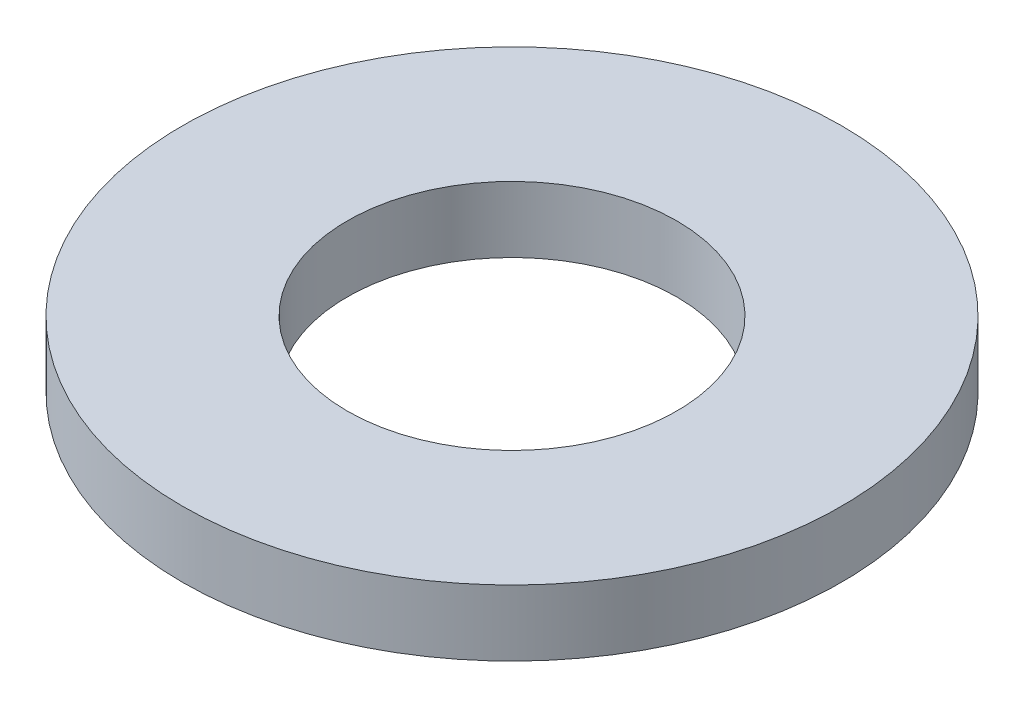
ISO-10303-21;
HEADER;
FILE_DESCRIPTION(('STEP AP214'),'2;1');
FILE_NAME('part.step','',(''),(''),'','','');
FILE_SCHEMA(('AUTOMOTIVE_DESIGN { 1 0 10303 214 1 1 1 1 }'));
ENDSEC;
DATA;
#1=APPLICATION_CONTEXT('core data for automotive mechanical design processes');
#2=APPLICATION_PROTOCOL_DEFINITION('international standard','automotive_design',2000,#1);
#3=PRODUCT_CONTEXT('',#1,'mechanical');
#4=PRODUCT('Part','Part','',(#3));
#5=PRODUCT_RELATED_PRODUCT_CATEGORY('part','',(#4));
#6=PRODUCT_DEFINITION_FORMATION('','',#4);
#7=PRODUCT_DEFINITION_CONTEXT('part definition',#1,'design');
#8=PRODUCT_DEFINITION('design','',#6,#7);
#9=PRODUCT_DEFINITION_SHAPE('','',#8);
#10=(LENGTH_UNIT() NAMED_UNIT(*) SI_UNIT(.MILLI.,.METRE.));
#11=(NAMED_UNIT(*) PLANE_ANGLE_UNIT() SI_UNIT($,.RADIAN.));
#12=(NAMED_UNIT(*) SI_UNIT($,.STERADIAN.) SOLID_ANGLE_UNIT());
#13=UNCERTAINTY_MEASURE_WITH_UNIT(LENGTH_MEASURE(1.E-05),#10,'distance_accuracy_value','');
#14=(GEOMETRIC_REPRESENTATION_CONTEXT(3) GLOBAL_UNCERTAINTY_ASSIGNED_CONTEXT((#13)) GLOBAL_UNIT_ASSIGNED_CONTEXT((#10,
#11,#12)) REPRESENTATION_CONTEXT('',''));
#15=CARTESIAN_POINT('',(0.,0.,0.));
#16=DIRECTION('',(0.,0.,1.));
#17=DIRECTION('',(1.,0.,0.));
#18=AXIS2_PLACEMENT_3D('',#15,#16,#17);
#19=CARTESIAN_POINT('',(0.,0.,0.));
#20=DIRECTION('',(0.,1.,0.));
#21=DIRECTION('',(0.,0.,1.));
#22=AXIS2_PLACEMENT_3D('',#19,#20,#21);
#23=CYLINDRICAL_SURFACE('',#22,2.);
#24=CARTESIAN_POINT('',(0.,0.,0.));
#25=DIRECTION('',(0.,1.,0.));
#26=DIRECTION('',(0.,0.,1.));
#27=AXIS2_PLACEMENT_3D('',#24,#25,#26);
#28=CIRCLE('',#27,2.);
#29=CARTESIAN_POINT('',(0.,0.,2.));
#30=VERTEX_POINT('',#29);
#31=EDGE_CURVE('E10',#30,#30,#28,.T.);
#32=ORIENTED_EDGE('',*,*,#31,.T.);
#33=EDGE_LOOP('',(#32));
#34=FACE_BOUND('',#33,.T.);
#35=CARTESIAN_POINT('',(0.,-0.8,0.));
#36=DIRECTION('',(0.,1.,0.));
#37=DIRECTION('',(0.,0.,1.));
#38=AXIS2_PLACEMENT_3D('',#35,#36,#37);
#39=CIRCLE('',#38,2.);
#40=CARTESIAN_POINT('',(0.,-0.8,2.));
#41=VERTEX_POINT('',#40);
#42=EDGE_CURVE('E44',#41,#41,#39,.T.);
#43=ORIENTED_EDGE('',*,*,#42,.F.);
#44=EDGE_LOOP('',(#43));
#45=FACE_BOUND('',#44,.T.);
#46=ADVANCED_FACE('F30',(#34,#45),#23,.F.);
#47=CARTESIAN_POINT('',(2.,0.,0.));
#48=DIRECTION('',(0.,1.,0.));
#49=DIRECTION('',(0.,0.,1.));
#50=AXIS2_PLACEMENT_3D('',#47,#48,#49);
#51=PLANE('',#50);
#52=CARTESIAN_POINT('',(0.,0.,0.));
#53=DIRECTION('',(0.,1.,0.));
#54=DIRECTION('',(0.,0.,1.));
#55=AXIS2_PLACEMENT_3D('',#52,#53,#54);
#56=CIRCLE('',#55,4.);
#57=CARTESIAN_POINT('',(0.,0.,4.));
#58=VERTEX_POINT('',#57);
#59=EDGE_CURVE('E36',#58,#58,#56,.T.);
#60=ORIENTED_EDGE('',*,*,#59,.T.);
#61=EDGE_LOOP('',(#60));
#62=FACE_BOUND('',#61,.T.);
#63=ORIENTED_EDGE('',*,*,#31,.F.);
#64=EDGE_LOOP('',(#63));
#65=FACE_BOUND('',#64,.T.);
#66=ADVANCED_FACE('F54',(#62,#65),#51,.T.);
#67=CARTESIAN_POINT('',(0.,0.,0.));
#68=DIRECTION('',(0.,1.,0.));
#69=DIRECTION('',(0.,0.,1.));
#70=AXIS2_PLACEMENT_3D('',#67,#68,#69);
#71=CYLINDRICAL_SURFACE('',#70,4.);
#72=CARTESIAN_POINT('',(0.,-0.8,0.));
#73=DIRECTION('',(0.,1.,0.));
#74=DIRECTION('',(0.,0.,1.));
#75=AXIS2_PLACEMENT_3D('',#72,#73,#74);
#76=CIRCLE('',#75,4.);
#77=CARTESIAN_POINT('',(0.,-0.8,4.));
#78=VERTEX_POINT('',#77);
#79=EDGE_CURVE('E40',#78,#78,#76,.T.);
#80=ORIENTED_EDGE('',*,*,#79,.T.);
#81=EDGE_LOOP('',(#80));
#82=FACE_BOUND('',#81,.T.);
#83=ORIENTED_EDGE('',*,*,#59,.F.);
#84=EDGE_LOOP('',(#83));
#85=FACE_BOUND('',#84,.T.);
#86=ADVANCED_FACE('F58',(#82,#85),#71,.T.);
#87=CARTESIAN_POINT('',(2.,-0.8,0.));
#88=DIRECTION('',(0.,-1.,0.));
#89=DIRECTION('',(0.,0.,-1.));
#90=AXIS2_PLACEMENT_3D('',#87,#88,#89);
#91=PLANE('',#90);
#92=ORIENTED_EDGE('',*,*,#42,.T.);
#93=EDGE_LOOP('',(#92));
#94=FACE_BOUND('',#93,.T.);
#95=ORIENTED_EDGE('',*,*,#79,.F.);
#96=EDGE_LOOP('',(#95));
#97=FACE_BOUND('',#96,.T.);
#98=ADVANCED_FACE('F50',(#94,#97),#91,.T.);
#99=CLOSED_SHELL('',(#46,#66,#86,#98));
#100=MANIFOLD_SOLID_BREP('B2',#99);
#101=ADVANCED_BREP_SHAPE_REPRESENTATION('',(#18,#100),#14);
#102=SHAPE_DEFINITION_REPRESENTATION(#9,#101);
ENDSEC;
END-ISO-10303-21;
